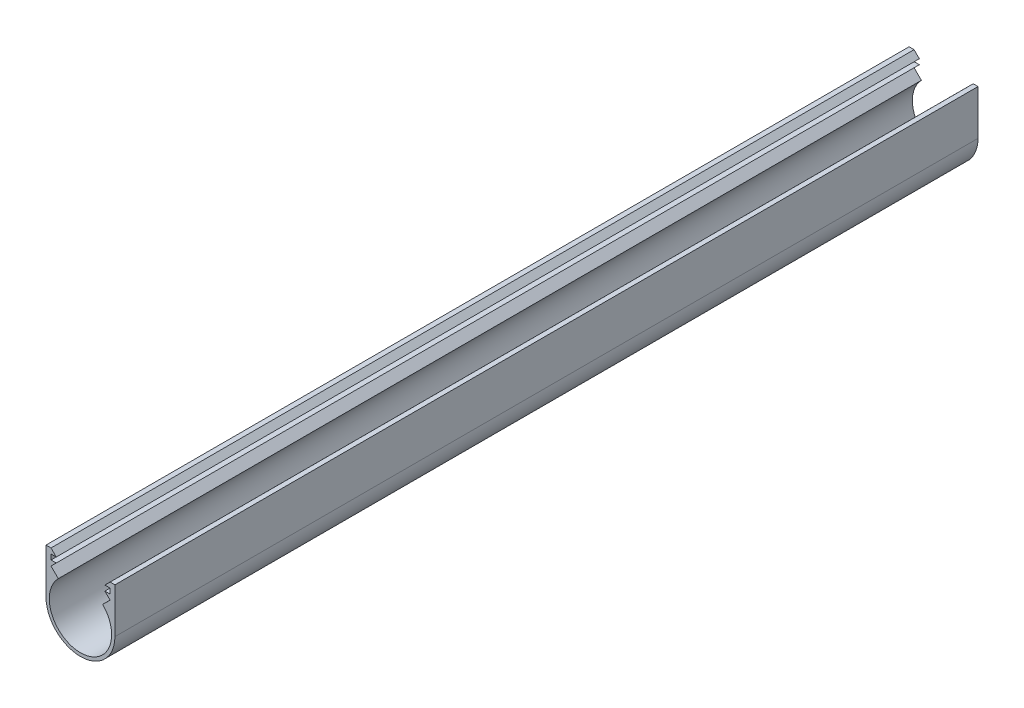
ISO-10303-21;
HEADER;
FILE_DESCRIPTION(('STEP AP214'),'2;1');
FILE_NAME('part.step','',(''),(''),'','','');
FILE_SCHEMA(('AUTOMOTIVE_DESIGN { 1 0 10303 214 1 1 1 1 }'));
ENDSEC;
DATA;
#1=APPLICATION_CONTEXT('core data for automotive mechanical design processes');
#2=APPLICATION_PROTOCOL_DEFINITION('international standard','automotive_design',2000,#1);
#3=PRODUCT_CONTEXT('',#1,'mechanical');
#4=PRODUCT('Part','Part','',(#3));
#5=PRODUCT_RELATED_PRODUCT_CATEGORY('part','',(#4));
#6=PRODUCT_DEFINITION_FORMATION('','',#4);
#7=PRODUCT_DEFINITION_CONTEXT('part definition',#1,'design');
#8=PRODUCT_DEFINITION('design','',#6,#7);
#9=PRODUCT_DEFINITION_SHAPE('','',#8);
#10=(LENGTH_UNIT() NAMED_UNIT(*) SI_UNIT(.MILLI.,.METRE.));
#11=(NAMED_UNIT(*) PLANE_ANGLE_UNIT() SI_UNIT($,.RADIAN.));
#12=(NAMED_UNIT(*) SI_UNIT($,.STERADIAN.) SOLID_ANGLE_UNIT());
#13=UNCERTAINTY_MEASURE_WITH_UNIT(LENGTH_MEASURE(1.E-05),#10,'distance_accuracy_value','');
#14=(GEOMETRIC_REPRESENTATION_CONTEXT(3) GLOBAL_UNCERTAINTY_ASSIGNED_CONTEXT((#13)) GLOBAL_UNIT_ASSIGNED_CONTEXT((#10,
#11,#12)) REPRESENTATION_CONTEXT('',''));
#15=CARTESIAN_POINT('',(0.,0.,0.));
#16=DIRECTION('',(0.,0.,1.));
#17=DIRECTION('',(1.,0.,0.));
#18=AXIS2_PLACEMENT_3D('',#15,#16,#17);
#19=CARTESIAN_POINT('',(0.,10.5,263.));
#20=DIRECTION('',(0.,-1.,0.));
#21=DIRECTION('',(0.,0.,-1.));
#22=AXIS2_PLACEMENT_3D('',#19,#20,#21);
#23=PLANE('',#22);
#24=DIRECTION('',(-1.,0.,0.));
#25=VECTOR('',#24,1.);
#26=CARTESIAN_POINT('',(0.,10.5,263.));
#27=LINE('',#26,#25);
#28=CARTESIAN_POINT('',(-7.3758,10.5,263.));
#29=VERTEX_POINT('',#28);
#30=CARTESIAN_POINT('',(-8.976,10.5,263.));
#31=VERTEX_POINT('',#30);
#32=EDGE_CURVE('E198',#29,#31,#27,.T.);
#33=ORIENTED_EDGE('',*,*,#32,.F.);
#34=DIRECTION('',(0.,0.,1.));
#35=VECTOR('',#34,1.);
#36=CARTESIAN_POINT('',(-7.3758,10.5,0.));
#37=LINE('',#36,#35);
#38=CARTESIAN_POINT('',(-7.3758,10.5,0.));
#39=VERTEX_POINT('',#38);
#40=EDGE_CURVE('E217',#39,#29,#37,.T.);
#41=ORIENTED_EDGE('',*,*,#40,.F.);
#42=DIRECTION('',(-1.,0.,0.));
#43=VECTOR('',#42,1.);
#44=CARTESIAN_POINT('',(0.,10.5,0.));
#45=LINE('',#44,#43);
#46=CARTESIAN_POINT('',(-8.976,10.5,0.));
#47=VERTEX_POINT('',#46);
#48=EDGE_CURVE('E187',#39,#47,#45,.T.);
#49=ORIENTED_EDGE('',*,*,#48,.T.);
#50=DIRECTION('',(0.,0.,1.));
#51=VECTOR('',#50,1.);
#52=CARTESIAN_POINT('',(-8.976,10.5,-4.45435187653598));
#53=LINE('',#52,#51);
#54=EDGE_CURVE('E216',#47,#31,#53,.T.);
#55=ORIENTED_EDGE('',*,*,#54,.T.);
#56=EDGE_LOOP('',(#33,#41,#49,#55));
#57=FACE_BOUND('',#56,.T.);
#58=ADVANCED_FACE('F36',(#57),#23,.F.);
#59=CARTESIAN_POINT('',(9.0326,10.5,0.));
#60=VERTEX_POINT('',#59);
#61=CARTESIAN_POINT('',(7.43239999999999,10.5,0.));
#62=VERTEX_POINT('',#61);
#63=EDGE_CURVE('E182',#60,#62,#45,.T.);
#64=ORIENTED_EDGE('',*,*,#63,.T.);
#65=DIRECTION('',(0.,0.,1.));
#66=VECTOR('',#65,1.);
#67=CARTESIAN_POINT('',(7.43239999999999,10.5,0.));
#68=LINE('',#67,#66);
#69=CARTESIAN_POINT('',(7.43239999999999,10.5,263.));
#70=VERTEX_POINT('',#69);
#71=EDGE_CURVE('E262',#62,#70,#68,.T.);
#72=ORIENTED_EDGE('',*,*,#71,.T.);
#73=CARTESIAN_POINT('',(9.0326,10.5,263.));
#74=VERTEX_POINT('',#73);
#75=EDGE_CURVE('E195',#74,#70,#27,.T.);
#76=ORIENTED_EDGE('',*,*,#75,.F.);
#77=DIRECTION('',(0.,0.,1.));
#78=VECTOR('',#77,1.);
#79=CARTESIAN_POINT('',(9.0326,10.5,-4.45435187653598));
#80=LINE('',#79,#78);
#81=EDGE_CURVE('E290',#60,#74,#80,.T.);
#82=ORIENTED_EDGE('',*,*,#81,.F.);
#83=EDGE_LOOP('',(#64,#72,#76,#82));
#84=FACE_BOUND('',#83,.T.);
#85=ADVANCED_FACE('F353',(#84),#23,.F.);
#86=CARTESIAN_POINT('',(-10.5,0.,263.));
#87=DIRECTION('',(-1.,0.,0.));
#88=DIRECTION('',(0.,0.,1.));
#89=AXIS2_PLACEMENT_3D('',#86,#87,#88);
#90=PLANE('',#89);
#91=DIRECTION('',(0.,1.,0.));
#92=VECTOR('',#91,1.);
#93=CARTESIAN_POINT('',(-10.5,0.,0.));
#94=LINE('',#93,#92);
#95=CARTESIAN_POINT('',(-10.5,0.,0.));
#96=VERTEX_POINT('',#95);
#97=CARTESIAN_POINT('',(-10.5,13.675,0.));
#98=VERTEX_POINT('',#97);
#99=EDGE_CURVE('E202',#96,#98,#94,.T.);
#100=ORIENTED_EDGE('',*,*,#99,.F.);
#101=DIRECTION('',(0.,0.,-1.));
#102=VECTOR('',#101,1.);
#103=CARTESIAN_POINT('',(-10.5,0.,263.));
#104=LINE('',#103,#102);
#105=CARTESIAN_POINT('',(-10.5,0.,263.));
#106=VERTEX_POINT('',#105);
#107=EDGE_CURVE('E11',#106,#96,#104,.T.);
#108=ORIENTED_EDGE('',*,*,#107,.F.);
#109=DIRECTION('',(0.,1.,0.));
#110=VECTOR('',#109,1.);
#111=CARTESIAN_POINT('',(-10.5,0.,263.));
#112=LINE('',#111,#110);
#113=CARTESIAN_POINT('',(-10.5,13.675,263.));
#114=VERTEX_POINT('',#113);
#115=EDGE_CURVE('E181',#106,#114,#112,.T.);
#116=ORIENTED_EDGE('',*,*,#115,.T.);
#117=DIRECTION('',(0.,0.,1.));
#118=VECTOR('',#117,1.);
#119=CARTESIAN_POINT('',(-10.5,13.675,-4.45435187653598));
#120=LINE('',#119,#118);
#121=EDGE_CURVE('E298',#98,#114,#120,.T.);
#122=ORIENTED_EDGE('',*,*,#121,.F.);
#123=EDGE_LOOP('',(#100,#108,#116,#122));
#124=FACE_BOUND('',#123,.T.);
#125=ADVANCED_FACE('F38',(#124),#90,.T.);
#126=CARTESIAN_POINT('',(0.,0.,263.));
#127=DIRECTION('',(0.,0.,-1.));
#128=DIRECTION('',(-1.,0.,0.));
#129=AXIS2_PLACEMENT_3D('',#126,#127,#128);
#130=CYLINDRICAL_SURFACE('',#129,10.5);
#131=CARTESIAN_POINT('',(0.,0.,0.));
#132=DIRECTION('',(0.,0.,1.));
#133=DIRECTION('',(1.,0.,0.));
#134=AXIS2_PLACEMENT_3D('',#131,#132,#133);
#135=CIRCLE('',#134,10.5);
#136=CARTESIAN_POINT('',(10.5,0.,0.));
#137=VERTEX_POINT('',#136);
#138=EDGE_CURVE('E204',#96,#137,#135,.T.);
#139=ORIENTED_EDGE('',*,*,#138,.T.);
#140=DIRECTION('',(0.,0.,-1.));
#141=VECTOR('',#140,1.);
#142=CARTESIAN_POINT('',(10.5,0.,263.));
#143=LINE('',#142,#141);
#144=CARTESIAN_POINT('',(10.5,0.,263.));
#145=VERTEX_POINT('',#144);
#146=EDGE_CURVE('E44',#145,#137,#143,.T.);
#147=ORIENTED_EDGE('',*,*,#146,.F.);
#148=CARTESIAN_POINT('',(0.,0.,263.));
#149=DIRECTION('',(0.,0.,1.));
#150=DIRECTION('',(1.,0.,0.));
#151=AXIS2_PLACEMENT_3D('',#148,#149,#150);
#152=CIRCLE('',#151,10.5);
#153=EDGE_CURVE('E184',#106,#145,#152,.T.);
#154=ORIENTED_EDGE('',*,*,#153,.F.);
#155=ORIENTED_EDGE('',*,*,#107,.T.);
#156=EDGE_LOOP('',(#139,#147,#154,#155));
#157=FACE_BOUND('',#156,.T.);
#158=ADVANCED_FACE('F329',(#157),#130,.T.);
#159=CARTESIAN_POINT('',(10.5,0.,263.));
#160=DIRECTION('',(-1.,0.,0.));
#161=DIRECTION('',(0.,0.,1.));
#162=AXIS2_PLACEMENT_3D('',#159,#160,#161);
#163=PLANE('',#162);
#164=DIRECTION('',(0.,1.,0.));
#165=VECTOR('',#164,1.);
#166=CARTESIAN_POINT('',(10.5,0.,0.));
#167=LINE('',#166,#165);
#168=CARTESIAN_POINT('',(10.5,13.675,0.));
#169=VERTEX_POINT('',#168);
#170=EDGE_CURVE('E206',#137,#169,#167,.T.);
#171=ORIENTED_EDGE('',*,*,#170,.T.);
#172=DIRECTION('',(0.,0.,1.));
#173=VECTOR('',#172,1.);
#174=CARTESIAN_POINT('',(10.5,13.675,-4.45435187653598));
#175=LINE('',#174,#173);
#176=CARTESIAN_POINT('',(10.5,13.675,263.));
#177=VERTEX_POINT('',#176);
#178=EDGE_CURVE('E288',#169,#177,#175,.T.);
#179=ORIENTED_EDGE('',*,*,#178,.T.);
#180=DIRECTION('',(0.,1.,0.));
#181=VECTOR('',#180,1.);
#182=CARTESIAN_POINT('',(10.5,0.,263.));
#183=LINE('',#182,#181);
#184=EDGE_CURVE('E239',#145,#177,#183,.T.);
#185=ORIENTED_EDGE('',*,*,#184,.F.);
#186=ORIENTED_EDGE('',*,*,#146,.T.);
#187=EDGE_LOOP('',(#171,#179,#185,#186));
#188=FACE_BOUND('',#187,.T.);
#189=ADVANCED_FACE('F330',(#188),#163,.F.);
#190=CARTESIAN_POINT('',(0.,0.,263.));
#191=DIRECTION('',(0.,0.,-1.));
#192=DIRECTION('',(-1.,0.,0.));
#193=AXIS2_PLACEMENT_3D('',#190,#191,#192);
#194=CYLINDRICAL_SURFACE('',#193,9.5);
#195=DIRECTION('',(0.,0.,1.));
#196=VECTOR('',#195,1.);
#197=CARTESIAN_POINT('',(-6.74608818957473,6.68881859063918,0.));
#198=LINE('',#197,#196);
#199=CARTESIAN_POINT('',(-6.74608818957473,6.68881859063918,0.));
#200=VERTEX_POINT('',#199);
#201=CARTESIAN_POINT('',(-6.74608818957473,6.68881859063918,263.));
#202=VERTEX_POINT('',#201);
#203=EDGE_CURVE('E256',#200,#202,#198,.T.);
#204=ORIENTED_EDGE('',*,*,#203,.T.);
#205=CARTESIAN_POINT('',(0.,0.,263.));
#206=DIRECTION('',(0.,0.,1.));
#207=DIRECTION('',(1.,0.,0.));
#208=AXIS2_PLACEMENT_3D('',#205,#206,#207);
#209=CIRCLE('',#208,9.5);
#210=CARTESIAN_POINT('',(6.76707601807863,6.66758443257714,263.));
#211=VERTEX_POINT('',#210);
#212=EDGE_CURVE('E177',#202,#211,#209,.T.);
#213=ORIENTED_EDGE('',*,*,#212,.T.);
#214=DIRECTION('',(0.,0.,1.));
#215=VECTOR('',#214,1.);
#216=CARTESIAN_POINT('',(6.76707601807863,6.66758443257714,0.));
#217=LINE('',#216,#215);
#218=CARTESIAN_POINT('',(6.76707601807863,6.66758443257714,0.));
#219=VERTEX_POINT('',#218);
#220=EDGE_CURVE('E163',#219,#211,#217,.T.);
#221=ORIENTED_EDGE('',*,*,#220,.F.);
#222=CARTESIAN_POINT('',(0.,0.,0.));
#223=DIRECTION('',(0.,0.,1.));
#224=DIRECTION('',(1.,0.,0.));
#225=AXIS2_PLACEMENT_3D('',#222,#223,#224);
#226=CIRCLE('',#225,9.5);
#227=EDGE_CURVE('E175',#200,#219,#226,.T.);
#228=ORIENTED_EDGE('',*,*,#227,.F.);
#229=EDGE_LOOP('',(#204,#213,#221,#228));
#230=FACE_BOUND('',#229,.T.);
#231=ADVANCED_FACE('F174',(#230),#194,.F.);
#232=CARTESIAN_POINT('',(0.,0.,263.));
#233=DIRECTION('',(0.,0.,1.));
#234=DIRECTION('',(1.,0.,0.));
#235=AXIS2_PLACEMENT_3D('',#232,#233,#234);
#236=PLANE('',#235);
#237=DIRECTION('',(0.710114546271025,-0.704086167435703,0.));
#238=VECTOR('',#237,1.);
#239=CARTESIAN_POINT('',(0.,0.,263.));
#240=LINE('',#239,#238);
#241=CARTESIAN_POINT('',(-8.976,8.8998,263.));
#242=VERTEX_POINT('',#241);
#243=EDGE_CURVE('E168',#242,#202,#240,.T.);
#244=ORIENTED_EDGE('',*,*,#243,.F.);
#245=DIRECTION('',(-0.707106781186547,-0.707106781186548,0.));
#246=VECTOR('',#245,1.);
#247=CARTESIAN_POINT('',(-8.93790000000001,8.9379,263.));
#248=LINE('',#247,#246);
#249=EDGE_CURVE('E247',#29,#242,#248,.T.);
#250=ORIENTED_EDGE('',*,*,#249,.F.);
#251=ORIENTED_EDGE('',*,*,#32,.T.);
#252=DIRECTION('',(0.,1.,0.));
#253=VECTOR('',#252,1.);
#254=CARTESIAN_POINT('',(-8.976,0.,263.));
#255=LINE('',#254,#253);
#256=CARTESIAN_POINT('',(-8.976,12.0748,263.));
#257=VERTEX_POINT('',#256);
#258=EDGE_CURVE('E228',#31,#257,#255,.T.);
#259=ORIENTED_EDGE('',*,*,#258,.T.);
#260=DIRECTION('',(1.,0.,0.));
#261=VECTOR('',#260,1.);
#262=CARTESIAN_POINT('',(0.,12.0748,263.));
#263=LINE('',#262,#261);
#264=CARTESIAN_POINT('',(-7.3758,12.0748,263.));
#265=VERTEX_POINT('',#264);
#266=EDGE_CURVE('E303',#257,#265,#263,.T.);
#267=ORIENTED_EDGE('',*,*,#266,.T.);
#268=DIRECTION('',(-0.707106781186548,0.707106781186548,0.));
#269=VECTOR('',#268,1.);
#270=CARTESIAN_POINT('',(2.3495,2.3495,263.));
#271=LINE('',#270,#269);
#272=CARTESIAN_POINT('',(-8.976,13.675,263.));
#273=VERTEX_POINT('',#272);
#274=EDGE_CURVE('E235',#265,#273,#271,.T.);
#275=ORIENTED_EDGE('',*,*,#274,.T.);
#276=DIRECTION('',(1.,0.,0.));
#277=VECTOR('',#276,1.);
#278=CARTESIAN_POINT('',(0.,13.675,263.));
#279=LINE('',#278,#277);
#280=EDGE_CURVE('E230',#114,#273,#279,.T.);
#281=ORIENTED_EDGE('',*,*,#280,.F.);
#282=ORIENTED_EDGE('',*,*,#115,.F.);
#283=ORIENTED_EDGE('',*,*,#153,.T.);
#284=ORIENTED_EDGE('',*,*,#184,.T.);
#285=DIRECTION('',(-1.,0.,0.));
#286=VECTOR('',#285,1.);
#287=CARTESIAN_POINT('',(0.,13.675,263.));
#288=LINE('',#287,#286);
#289=CARTESIAN_POINT('',(9.0326,13.675,263.));
#290=VERTEX_POINT('',#289);
#291=EDGE_CURVE('E278',#177,#290,#288,.T.);
#292=ORIENTED_EDGE('',*,*,#291,.T.);
#293=DIRECTION('',(-0.709643630377278,-0.70456079784853,0.));
#294=VECTOR('',#293,1.);
#295=CARTESIAN_POINT('',(-2.35348725820519,2.37046575264957,263.));
#296=LINE('',#295,#294);
#297=CARTESIAN_POINT('',(7.4324,12.0862614551084,263.));
#298=VERTEX_POINT('',#297);
#299=EDGE_CURVE('E280',#290,#298,#296,.T.);
#300=ORIENTED_EDGE('',*,*,#299,.T.);
#301=DIRECTION('',(0.999999700466927,0.000773993576212847,0.));
#302=VECTOR('',#301,1.);
#303=CARTESIAN_POINT('',(-0.00935023342608939,12.0805015865066,263.));
#304=LINE('',#303,#302);
#305=CARTESIAN_POINT('',(9.0326,12.0875,263.));
#306=VERTEX_POINT('',#305);
#307=EDGE_CURVE('E258',#298,#306,#304,.T.);
#308=ORIENTED_EDGE('',*,*,#307,.T.);
#309=DIRECTION('',(0.,1.,0.));
#310=VECTOR('',#309,1.);
#311=CARTESIAN_POINT('',(9.0326,0.,263.));
#312=LINE('',#311,#310);
#313=EDGE_CURVE('E275',#74,#306,#312,.T.);
#314=ORIENTED_EDGE('',*,*,#313,.F.);
#315=ORIENTED_EDGE('',*,*,#75,.T.);
#316=DIRECTION('',(-0.707106781186549,0.707106781186546,0.));
#317=VECTOR('',#316,1.);
#318=CARTESIAN_POINT('',(8.96619999999999,8.96620000000001,263.));
#319=LINE('',#318,#317);
#320=CARTESIAN_POINT('',(9.0326,8.8998,263.));
#321=VERTEX_POINT('',#320);
#322=EDGE_CURVE('E249',#321,#70,#319,.T.);
#323=ORIENTED_EDGE('',*,*,#322,.F.);
#324=DIRECTION('',(-0.712323791376698,-0.701850992902857,0.));
#325=VECTOR('',#324,1.);
#326=CARTESIAN_POINT('',(0.,0.,263.));
#327=LINE('',#326,#325);
#328=EDGE_CURVE('E252',#321,#211,#327,.T.);
#329=ORIENTED_EDGE('',*,*,#328,.T.);
#330=ORIENTED_EDGE('',*,*,#212,.F.);
#331=EDGE_LOOP('',(#244,#250,#251,#259,#267,#275,#281,#282,#283,#284,#292,#300,#308,#314,#315,
#323,#329,#330));
#332=FACE_BOUND('',#331,.T.);
#333=ADVANCED_FACE('F244',(#332),#236,.T.);
#334=CARTESIAN_POINT('',(0.,0.,0.));
#335=DIRECTION('',(0.,0.,1.));
#336=DIRECTION('',(1.,0.,0.));
#337=AXIS2_PLACEMENT_3D('',#334,#335,#336);
#338=PLANE('',#337);
#339=DIRECTION('',(-0.707106781186547,-0.707106781186548,0.));
#340=VECTOR('',#339,1.);
#341=CARTESIAN_POINT('',(-8.93790000000001,8.9379,0.));
#342=LINE('',#341,#340);
#343=CARTESIAN_POINT('',(-8.976,8.8998,0.));
#344=VERTEX_POINT('',#343);
#345=EDGE_CURVE('E355',#39,#344,#342,.T.);
#346=ORIENTED_EDGE('',*,*,#345,.T.);
#347=DIRECTION('',(0.710114546271025,-0.704086167435703,0.));
#348=VECTOR('',#347,1.);
#349=CARTESIAN_POINT('',(0.,0.,0.));
#350=LINE('',#349,#348);
#351=EDGE_CURVE('E51',#344,#200,#350,.T.);
#352=ORIENTED_EDGE('',*,*,#351,.T.);
#353=ORIENTED_EDGE('',*,*,#227,.T.);
#354=DIRECTION('',(-0.712323791376698,-0.701850992902857,0.));
#355=VECTOR('',#354,1.);
#356=CARTESIAN_POINT('',(0.,0.,0.));
#357=LINE('',#356,#355);
#358=CARTESIAN_POINT('',(9.0326,8.8998,0.));
#359=VERTEX_POINT('',#358);
#360=EDGE_CURVE('E159',#359,#219,#357,.T.);
#361=ORIENTED_EDGE('',*,*,#360,.F.);
#362=DIRECTION('',(-0.707106781186549,0.707106781186546,0.));
#363=VECTOR('',#362,1.);
#364=CARTESIAN_POINT('',(8.96619999999999,8.96620000000001,0.));
#365=LINE('',#364,#363);
#366=EDGE_CURVE('E59',#359,#62,#365,.T.);
#367=ORIENTED_EDGE('',*,*,#366,.T.);
#368=ORIENTED_EDGE('',*,*,#63,.F.);
#369=DIRECTION('',(0.,-1.,0.));
#370=VECTOR('',#369,1.);
#371=CARTESIAN_POINT('',(9.0326,0.,0.));
#372=LINE('',#371,#370);
#373=CARTESIAN_POINT('',(9.0326,12.0875,0.));
#374=VERTEX_POINT('',#373);
#375=EDGE_CURVE('E269',#374,#60,#372,.T.);
#376=ORIENTED_EDGE('',*,*,#375,.F.);
#377=DIRECTION('',(-0.999999700466927,-0.000773993576212847,0.));
#378=VECTOR('',#377,1.);
#379=CARTESIAN_POINT('',(-0.00935023342608939,12.0805015865066,0.));
#380=LINE('',#379,#378);
#381=CARTESIAN_POINT('',(7.4324,12.0862614551084,0.));
#382=VERTEX_POINT('',#381);
#383=EDGE_CURVE('E271',#374,#382,#380,.T.);
#384=ORIENTED_EDGE('',*,*,#383,.T.);
#385=DIRECTION('',(0.709643630377278,0.70456079784853,0.));
#386=VECTOR('',#385,1.);
#387=CARTESIAN_POINT('',(-2.35348725820519,2.37046575264957,0.));
#388=LINE('',#387,#386);
#389=CARTESIAN_POINT('',(9.0326,13.675,0.));
#390=VERTEX_POINT('',#389);
#391=EDGE_CURVE('E268',#382,#390,#388,.T.);
#392=ORIENTED_EDGE('',*,*,#391,.T.);
#393=DIRECTION('',(1.,0.,0.));
#394=VECTOR('',#393,1.);
#395=CARTESIAN_POINT('',(0.,13.675,0.));
#396=LINE('',#395,#394);
#397=EDGE_CURVE('E266',#390,#169,#396,.T.);
#398=ORIENTED_EDGE('',*,*,#397,.T.);
#399=ORIENTED_EDGE('',*,*,#170,.F.);
#400=ORIENTED_EDGE('',*,*,#138,.F.);
#401=ORIENTED_EDGE('',*,*,#99,.T.);
#402=DIRECTION('',(-1.,0.,0.));
#403=VECTOR('',#402,1.);
#404=CARTESIAN_POINT('',(0.,13.675,0.));
#405=LINE('',#404,#403);
#406=CARTESIAN_POINT('',(-8.976,13.675,0.));
#407=VERTEX_POINT('',#406);
#408=EDGE_CURVE('E223',#407,#98,#405,.T.);
#409=ORIENTED_EDGE('',*,*,#408,.F.);
#410=DIRECTION('',(0.707106781186548,-0.707106781186548,0.));
#411=VECTOR('',#410,1.);
#412=CARTESIAN_POINT('',(2.3495,2.3495,0.));
#413=LINE('',#412,#411);
#414=CARTESIAN_POINT('',(-7.3758,12.0748,0.));
#415=VERTEX_POINT('',#414);
#416=EDGE_CURVE('E297',#407,#415,#413,.T.);
#417=ORIENTED_EDGE('',*,*,#416,.T.);
#418=DIRECTION('',(-1.,0.,0.));
#419=VECTOR('',#418,1.);
#420=CARTESIAN_POINT('',(0.,12.0748,0.));
#421=LINE('',#420,#419);
#422=CARTESIAN_POINT('',(-8.976,12.0748,0.));
#423=VERTEX_POINT('',#422);
#424=EDGE_CURVE('E220',#415,#423,#421,.T.);
#425=ORIENTED_EDGE('',*,*,#424,.T.);
#426=DIRECTION('',(0.,-1.,0.));
#427=VECTOR('',#426,1.);
#428=CARTESIAN_POINT('',(-8.976,0.,0.));
#429=LINE('',#428,#427);
#430=EDGE_CURVE('E205',#423,#47,#429,.T.);
#431=ORIENTED_EDGE('',*,*,#430,.T.);
#432=ORIENTED_EDGE('',*,*,#48,.F.);
#433=EDGE_LOOP('',(#346,#352,#353,#361,#367,#368,#376,#384,#392,#398,#399,#400,#401,#409,#417,
#425,#431,#432));
#434=FACE_BOUND('',#433,.T.);
#435=ADVANCED_FACE('F180',(#434),#338,.F.);
#436=CARTESIAN_POINT('',(0.,13.675,-4.45435187653598));
#437=DIRECTION('',(0.,-1.,0.));
#438=DIRECTION('',(0.,0.,-1.));
#439=AXIS2_PLACEMENT_3D('',#436,#437,#438);
#440=PLANE('',#439);
#441=DIRECTION('',(0.,0.,1.));
#442=VECTOR('',#441,1.);
#443=CARTESIAN_POINT('',(-8.976,13.675,-4.45435187653598));
#444=LINE('',#443,#442);
#445=EDGE_CURVE('E309',#407,#273,#444,.T.);
#446=ORIENTED_EDGE('',*,*,#445,.F.);
#447=ORIENTED_EDGE('',*,*,#408,.T.);
#448=ORIENTED_EDGE('',*,*,#121,.T.);
#449=ORIENTED_EDGE('',*,*,#280,.T.);
#450=EDGE_LOOP('',(#446,#447,#448,#449));
#451=FACE_BOUND('',#450,.T.);
#452=ADVANCED_FACE('F322',(#451),#440,.F.);
#453=CARTESIAN_POINT('',(2.3495,2.3495,-4.45435187653598));
#454=DIRECTION('',(0.707106781186548,0.707106781186548,0.));
#455=DIRECTION('',(-0.707106781186548,0.707106781186548,0.));
#456=AXIS2_PLACEMENT_3D('',#453,#454,#455);
#457=PLANE('',#456);
#458=ORIENTED_EDGE('',*,*,#416,.F.);
#459=ORIENTED_EDGE('',*,*,#445,.T.);
#460=ORIENTED_EDGE('',*,*,#274,.F.);
#461=DIRECTION('',(0.,0.,1.));
#462=VECTOR('',#461,1.);
#463=CARTESIAN_POINT('',(-7.3758,12.0748,-4.45435187653598));
#464=LINE('',#463,#462);
#465=EDGE_CURVE('E232',#415,#265,#464,.T.);
#466=ORIENTED_EDGE('',*,*,#465,.F.);
#467=EDGE_LOOP('',(#458,#459,#460,#466));
#468=FACE_BOUND('',#467,.T.);
#469=ADVANCED_FACE('F317',(#468),#457,.T.);
#470=CARTESIAN_POINT('',(0.,12.0748,-4.45435187653598));
#471=DIRECTION('',(0.,-1.,0.));
#472=DIRECTION('',(0.,0.,-1.));
#473=AXIS2_PLACEMENT_3D('',#470,#471,#472);
#474=PLANE('',#473);
#475=ORIENTED_EDGE('',*,*,#424,.F.);
#476=ORIENTED_EDGE('',*,*,#465,.T.);
#477=ORIENTED_EDGE('',*,*,#266,.F.);
#478=DIRECTION('',(0.,0.,1.));
#479=VECTOR('',#478,1.);
#480=CARTESIAN_POINT('',(-8.976,12.0748,-4.45435187653598));
#481=LINE('',#480,#479);
#482=EDGE_CURVE('E229',#423,#257,#481,.T.);
#483=ORIENTED_EDGE('',*,*,#482,.F.);
#484=EDGE_LOOP('',(#475,#476,#477,#483));
#485=FACE_BOUND('',#484,.T.);
#486=ADVANCED_FACE('F314',(#485),#474,.T.);
#487=CARTESIAN_POINT('',(-8.976,0.,-4.45435187653598));
#488=DIRECTION('',(1.,0.,0.));
#489=DIRECTION('',(0.,0.,-1.));
#490=AXIS2_PLACEMENT_3D('',#487,#488,#489);
#491=PLANE('',#490);
#492=ORIENTED_EDGE('',*,*,#430,.F.);
#493=ORIENTED_EDGE('',*,*,#482,.T.);
#494=ORIENTED_EDGE('',*,*,#258,.F.);
#495=ORIENTED_EDGE('',*,*,#54,.F.);
#496=EDGE_LOOP('',(#492,#493,#494,#495));
#497=FACE_BOUND('',#496,.T.);
#498=ADVANCED_FACE('F226',(#497),#491,.T.);
#499=CARTESIAN_POINT('',(9.0326,0.,-4.45435187653598));
#500=DIRECTION('',(1.,0.,0.));
#501=DIRECTION('',(0.,0.,-1.));
#502=AXIS2_PLACEMENT_3D('',#499,#500,#501);
#503=PLANE('',#502);
#504=DIRECTION('',(0.,0.,1.));
#505=VECTOR('',#504,1.);
#506=CARTESIAN_POINT('',(9.0326,12.0875,-4.45435187653598));
#507=LINE('',#506,#505);
#508=EDGE_CURVE('E283',#374,#306,#507,.T.);
#509=ORIENTED_EDGE('',*,*,#508,.F.);
#510=ORIENTED_EDGE('',*,*,#375,.T.);
#511=ORIENTED_EDGE('',*,*,#81,.T.);
#512=ORIENTED_EDGE('',*,*,#313,.T.);
#513=EDGE_LOOP('',(#509,#510,#511,#512));
#514=FACE_BOUND('',#513,.T.);
#515=ADVANCED_FACE('F350',(#514),#503,.F.);
#516=CARTESIAN_POINT('',(0.,13.675,-4.45435187653598));
#517=DIRECTION('',(0.,1.,0.));
#518=DIRECTION('',(0.,0.,1.));
#519=AXIS2_PLACEMENT_3D('',#516,#517,#518);
#520=PLANE('',#519);
#521=ORIENTED_EDGE('',*,*,#397,.F.);
#522=DIRECTION('',(0.,0.,1.));
#523=VECTOR('',#522,1.);
#524=CARTESIAN_POINT('',(9.0326,13.675,-4.45435187653598));
#525=LINE('',#524,#523);
#526=EDGE_CURVE('E286',#390,#290,#525,.T.);
#527=ORIENTED_EDGE('',*,*,#526,.T.);
#528=ORIENTED_EDGE('',*,*,#291,.F.);
#529=ORIENTED_EDGE('',*,*,#178,.F.);
#530=EDGE_LOOP('',(#521,#527,#528,#529));
#531=FACE_BOUND('',#530,.T.);
#532=ADVANCED_FACE('F335',(#531),#520,.T.);
#533=CARTESIAN_POINT('',(-2.35348725820519,2.37046575264957,-4.45435187653598));
#534=DIRECTION('',(-0.70456079784853,0.709643630377278,0.));
#535=DIRECTION('',(-0.709643630377278,-0.70456079784853,0.));
#536=AXIS2_PLACEMENT_3D('',#533,#534,#535);
#537=PLANE('',#536);
#538=ORIENTED_EDGE('',*,*,#391,.F.);
#539=DIRECTION('',(0.,0.,1.));
#540=VECTOR('',#539,1.);
#541=CARTESIAN_POINT('',(7.4324,12.0862614551084,-4.45435187653598));
#542=LINE('',#541,#540);
#543=EDGE_CURVE('E284',#382,#298,#542,.T.);
#544=ORIENTED_EDGE('',*,*,#543,.T.);
#545=ORIENTED_EDGE('',*,*,#299,.F.);
#546=ORIENTED_EDGE('',*,*,#526,.F.);
#547=EDGE_LOOP('',(#538,#544,#545,#546));
#548=FACE_BOUND('',#547,.T.);
#549=ADVANCED_FACE('F340',(#548),#537,.T.);
#550=CARTESIAN_POINT('',(-0.00935023342608939,12.0805015865066,-4.45435187653598));
#551=DIRECTION('',(0.000773993576212847,-0.999999700466927,0.));
#552=DIRECTION('',(0.999999700466927,0.000773993576212847,0.));
#553=AXIS2_PLACEMENT_3D('',#550,#551,#552);
#554=PLANE('',#553);
#555=ORIENTED_EDGE('',*,*,#383,.F.);
#556=ORIENTED_EDGE('',*,*,#508,.T.);
#557=ORIENTED_EDGE('',*,*,#307,.F.);
#558=ORIENTED_EDGE('',*,*,#543,.F.);
#559=EDGE_LOOP('',(#555,#556,#557,#558));
#560=FACE_BOUND('',#559,.T.);
#561=ADVANCED_FACE('F345',(#560),#554,.T.);
#562=CARTESIAN_POINT('',(0.,0.,0.));
#563=DIRECTION('',(-0.701850992902857,0.712323791376698,0.));
#564=DIRECTION('',(-0.712323791376698,-0.701850992902857,0.));
#565=AXIS2_PLACEMENT_3D('',#562,#563,#564);
#566=PLANE('',#565);
#567=ORIENTED_EDGE('',*,*,#328,.F.);
#568=DIRECTION('',(0.,0.,1.));
#569=VECTOR('',#568,1.);
#570=CARTESIAN_POINT('',(9.0326,8.8998,0.));
#571=LINE('',#570,#569);
#572=EDGE_CURVE('E165',#359,#321,#571,.T.);
#573=ORIENTED_EDGE('',*,*,#572,.F.);
#574=ORIENTED_EDGE('',*,*,#360,.T.);
#575=ORIENTED_EDGE('',*,*,#220,.T.);
#576=EDGE_LOOP('',(#567,#573,#574,#575));
#577=FACE_BOUND('',#576,.T.);
#578=ADVANCED_FACE('F162',(#577),#566,.T.);
#579=CARTESIAN_POINT('',(8.96619999999999,8.96620000000001,0.));
#580=DIRECTION('',(0.707106781186546,0.707106781186549,0.));
#581=DIRECTION('',(-0.707106781186549,0.707106781186546,0.));
#582=AXIS2_PLACEMENT_3D('',#579,#580,#581);
#583=PLANE('',#582);
#584=ORIENTED_EDGE('',*,*,#322,.T.);
#585=ORIENTED_EDGE('',*,*,#71,.F.);
#586=ORIENTED_EDGE('',*,*,#366,.F.);
#587=ORIENTED_EDGE('',*,*,#572,.T.);
#588=EDGE_LOOP('',(#584,#585,#586,#587));
#589=FACE_BOUND('',#588,.T.);
#590=ADVANCED_FACE('F354',(#589),#583,.F.);
#591=CARTESIAN_POINT('',(0.,0.,0.));
#592=DIRECTION('',(-0.704086167435703,-0.710114546271025,0.));
#593=DIRECTION('',(0.710114546271025,-0.704086167435703,0.));
#594=AXIS2_PLACEMENT_3D('',#591,#592,#593);
#595=PLANE('',#594);
#596=ORIENTED_EDGE('',*,*,#243,.T.);
#597=ORIENTED_EDGE('',*,*,#203,.F.);
#598=ORIENTED_EDGE('',*,*,#351,.F.);
#599=DIRECTION('',(0.,0.,1.));
#600=VECTOR('',#599,1.);
#601=CARTESIAN_POINT('',(-8.976,8.8998,0.));
#602=LINE('',#601,#600);
#603=EDGE_CURVE('E259',#344,#242,#602,.T.);
#604=ORIENTED_EDGE('',*,*,#603,.T.);
#605=EDGE_LOOP('',(#596,#597,#598,#604));
#606=FACE_BOUND('',#605,.T.);
#607=ADVANCED_FACE('F360',(#606),#595,.F.);
#608=CARTESIAN_POINT('',(-8.93790000000001,8.9379,0.));
#609=DIRECTION('',(-0.707106781186548,0.707106781186547,0.));
#610=DIRECTION('',(-0.707106781186547,-0.707106781186548,0.));
#611=AXIS2_PLACEMENT_3D('',#608,#609,#610);
#612=PLANE('',#611);
#613=ORIENTED_EDGE('',*,*,#249,.T.);
#614=ORIENTED_EDGE('',*,*,#603,.F.);
#615=ORIENTED_EDGE('',*,*,#345,.F.);
#616=ORIENTED_EDGE('',*,*,#40,.T.);
#617=EDGE_LOOP('',(#613,#614,#615,#616));
#618=FACE_BOUND('',#617,.T.);
#619=ADVANCED_FACE('F359',(#618),#612,.F.);
#620=CLOSED_SHELL('',(#58,#85,#125,#158,#189,#231,#333,#435,#452,#469,#486,#498,#515,#532,#549,
#561,#578,#590,#607,#619));
#621=MANIFOLD_SOLID_BREP('B2',#620);
#622=ADVANCED_BREP_SHAPE_REPRESENTATION('',(#18,#621),#14);
#623=SHAPE_DEFINITION_REPRESENTATION(#9,#622);
ENDSEC;
END-ISO-10303-21;
